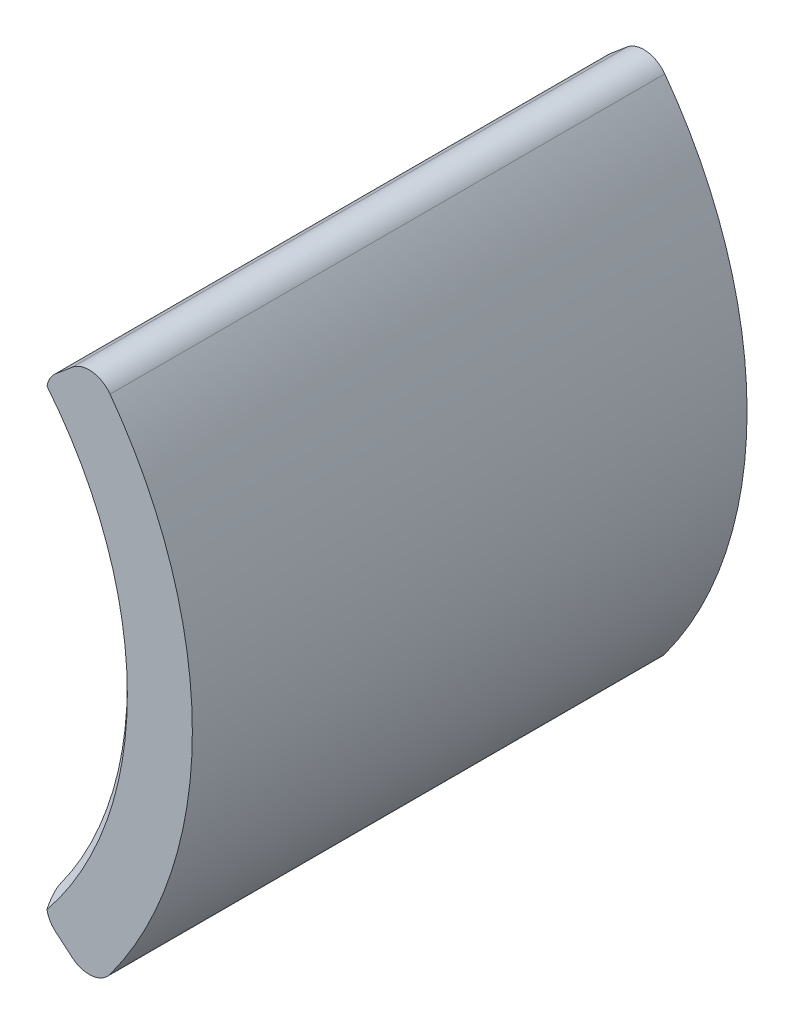
ISO-10303-21;
HEADER;
FILE_DESCRIPTION(('STEP AP214'),'2;1');
FILE_NAME('part.step','',(''),(''),'','','');
FILE_SCHEMA(('AUTOMOTIVE_DESIGN { 1 0 10303 214 1 1 1 1 }'));
ENDSEC;
DATA;
#1=APPLICATION_CONTEXT('core data for automotive mechanical design processes');
#2=APPLICATION_PROTOCOL_DEFINITION('international standard','automotive_design',2000,#1);
#3=PRODUCT_CONTEXT('',#1,'mechanical');
#4=PRODUCT('Part','Part','',(#3));
#5=PRODUCT_RELATED_PRODUCT_CATEGORY('part','',(#4));
#6=PRODUCT_DEFINITION_FORMATION('','',#4);
#7=PRODUCT_DEFINITION_CONTEXT('part definition',#1,'design');
#8=PRODUCT_DEFINITION('design','',#6,#7);
#9=PRODUCT_DEFINITION_SHAPE('','',#8);
#10=(LENGTH_UNIT() NAMED_UNIT(*) SI_UNIT(.MILLI.,.METRE.));
#11=(NAMED_UNIT(*) PLANE_ANGLE_UNIT() SI_UNIT($,.RADIAN.));
#12=(NAMED_UNIT(*) SI_UNIT($,.STERADIAN.) SOLID_ANGLE_UNIT());
#13=UNCERTAINTY_MEASURE_WITH_UNIT(LENGTH_MEASURE(1.E-05),#10,'distance_accuracy_value','');
#14=(GEOMETRIC_REPRESENTATION_CONTEXT(3) GLOBAL_UNCERTAINTY_ASSIGNED_CONTEXT((#13)) GLOBAL_UNIT_ASSIGNED_CONTEXT((#10,
#11,#12)) REPRESENTATION_CONTEXT('',''));
#15=CARTESIAN_POINT('',(0.,0.,0.));
#16=DIRECTION('',(0.,0.,1.));
#17=DIRECTION('',(1.,0.,0.));
#18=AXIS2_PLACEMENT_3D('',#15,#16,#17);
#19=CARTESIAN_POINT('',(0.,0.,64.));
#20=DIRECTION('',(0.,0.,-1.));
#21=DIRECTION('',(-1.,0.,0.));
#22=AXIS2_PLACEMENT_3D('',#19,#20,#21);
#23=CYLINDRICAL_SURFACE('',#22,49.);
#24=CARTESIAN_POINT('',(0.,0.,64.));
#25=DIRECTION('',(0.,0.,1.));
#26=DIRECTION('',(1.,0.,0.));
#27=AXIS2_PLACEMENT_3D('',#24,#25,#26);
#28=CIRCLE('',#27,49.);
#29=CARTESIAN_POINT('',(39.5103918075658,-28.9815275514013,64.));
#30=VERTEX_POINT('',#29);
#31=CARTESIAN_POINT('',(39.5103918075658,28.9815275514013,64.));
#32=VERTEX_POINT('',#31);
#33=EDGE_CURVE('E135',#30,#32,#28,.T.);
#34=ORIENTED_EDGE('',*,*,#33,.F.);
#35=DIRECTION('',(0.,0.,-1.));
#36=VECTOR('',#35,1.);
#37=CARTESIAN_POINT('',(39.5103918075658,-28.9815275514013,64.));
#38=LINE('',#37,#36);
#39=CARTESIAN_POINT('',(39.5103918075658,-28.9815275514013,0.));
#40=VERTEX_POINT('',#39);
#41=EDGE_CURVE('E120',#30,#40,#38,.T.);
#42=ORIENTED_EDGE('',*,*,#41,.T.);
#43=CARTESIAN_POINT('',(0.,0.,0.));
#44=DIRECTION('',(0.,0.,1.));
#45=DIRECTION('',(1.,0.,0.));
#46=AXIS2_PLACEMENT_3D('',#43,#44,#45);
#47=CIRCLE('',#46,49.);
#48=CARTESIAN_POINT('',(39.5103918075658,28.9815275514013,0.));
#49=VERTEX_POINT('',#48);
#50=EDGE_CURVE('E132',#40,#49,#47,.T.);
#51=ORIENTED_EDGE('',*,*,#50,.T.);
#52=DIRECTION('',(0.,0.,-1.));
#53=VECTOR('',#52,1.);
#54=CARTESIAN_POINT('',(39.5103918075658,28.9815275514013,64.));
#55=LINE('',#54,#53);
#56=EDGE_CURVE('E137',#49,#32,#55,.F.);
#57=ORIENTED_EDGE('',*,*,#56,.T.);
#58=EDGE_LOOP('',(#34,#42,#51,#57));
#59=FACE_BOUND('',#58,.T.);
#60=ADVANCED_FACE('F38',(#59),#23,.T.);
#61=CARTESIAN_POINT('',(31.0247999463187,26.0328981923047,64.));
#62=DIRECTION('',(0.642787609686535,-0.766044443118982,0.));
#63=DIRECTION('',(0.766044443118981,0.642787609686535,0.));
#64=AXIS2_PLACEMENT_3D('',#61,#62,#63);
#65=PLANE('',#64);
#66=DIRECTION('',(-0.766044443118981,-0.642787609686535,0.));
#67=VECTOR('',#66,1.);
#68=CARTESIAN_POINT('',(31.0247999463187,26.0328981923047,64.));
#69=LINE('',#68,#67);
#70=CARTESIAN_POINT('',(35.1630253984512,29.5052816429174,64.));
#71=VERTEX_POINT('',#70);
#72=CARTESIAN_POINT('',(33.2435928457746,27.8946864958968,64.));
#73=VERTEX_POINT('',#72);
#74=EDGE_CURVE('E153',#71,#73,#69,.T.);
#75=ORIENTED_EDGE('',*,*,#74,.F.);
#76=DIRECTION('',(0.,0.,-1.));
#77=VECTOR('',#76,1.);
#78=CARTESIAN_POINT('',(35.1630253984512,29.5052816429174,64.));
#79=LINE('',#78,#77);
#80=CARTESIAN_POINT('',(35.1630253984512,29.5052816429174,0.));
#81=VERTEX_POINT('',#80);
#82=EDGE_CURVE('E11',#71,#81,#79,.T.);
#83=ORIENTED_EDGE('',*,*,#82,.T.);
#84=DIRECTION('',(-0.766044443118981,-0.642787609686535,0.));
#85=VECTOR('',#84,1.);
#86=CARTESIAN_POINT('',(31.0247999463187,26.0328981923047,0.));
#87=LINE('',#86,#85);
#88=CARTESIAN_POINT('',(33.2435928457746,27.8946864958968,0.));
#89=VERTEX_POINT('',#88);
#90=EDGE_CURVE('E142',#81,#89,#87,.T.);
#91=ORIENTED_EDGE('',*,*,#90,.T.);
#92=DIRECTION('',(0.,0.,-1.));
#93=VECTOR('',#92,1.);
#94=CARTESIAN_POINT('',(33.2435928457746,27.8946864958968,64.));
#95=LINE('',#94,#93);
#96=EDGE_CURVE('E45',#89,#73,#95,.F.);
#97=ORIENTED_EDGE('',*,*,#96,.T.);
#98=EDGE_LOOP('',(#75,#83,#91,#97));
#99=FACE_BOUND('',#98,.T.);
#100=ADVANCED_FACE('F236',(#99),#65,.F.);
#101=CARTESIAN_POINT('',(0.,0.,64.));
#102=DIRECTION('',(0.,0.,-1.));
#103=DIRECTION('',(-1.,0.,0.));
#104=AXIS2_PLACEMENT_3D('',#101,#102,#103);
#105=CYLINDRICAL_SURFACE('',#104,40.5);
#106=CARTESIAN_POINT('',(0.,0.,0.999999999999987));
#107=DIRECTION('',(0.,0.,1.));
#108=DIRECTION('',(1.,0.,0.));
#109=AXIS2_PLACEMENT_3D('',#106,#107,#108);
#110=CIRCLE('',#109,40.5);
#111=CARTESIAN_POINT('',(32.7463035593284,23.831273637813,0.999999999999987));
#112=VERTEX_POINT('',#111);
#113=CARTESIAN_POINT('',(32.7463035593284,-23.831273637813,0.999999999999987));
#114=VERTEX_POINT('',#113);
#115=EDGE_CURVE('E158',#112,#114,#110,.F.);
#116=ORIENTED_EDGE('',*,*,#115,.T.);
#117=DIRECTION('',(0.,0.,-1.));
#118=VECTOR('',#117,1.);
#119=CARTESIAN_POINT('',(32.7463035593284,-23.831273637813,64.));
#120=LINE('',#119,#118);
#121=CARTESIAN_POINT('',(32.7463035593284,-23.831273637813,63.));
#122=VERTEX_POINT('',#121);
#123=EDGE_CURVE('E59',#114,#122,#120,.F.);
#124=ORIENTED_EDGE('',*,*,#123,.T.);
#125=CARTESIAN_POINT('',(0.,0.,63.));
#126=DIRECTION('',(0.,0.,1.));
#127=DIRECTION('',(1.,0.,0.));
#128=AXIS2_PLACEMENT_3D('',#125,#126,#127);
#129=CIRCLE('',#128,40.5);
#130=CARTESIAN_POINT('',(32.7463035593284,23.831273637813,63.));
#131=VERTEX_POINT('',#130);
#132=EDGE_CURVE('E156',#122,#131,#129,.T.);
#133=ORIENTED_EDGE('',*,*,#132,.T.);
#134=DIRECTION('',(0.,0.,-1.));
#135=VECTOR('',#134,1.);
#136=CARTESIAN_POINT('',(32.7463035593284,23.831273637813,64.));
#137=LINE('',#136,#135);
#138=EDGE_CURVE('E266',#131,#112,#137,.T.);
#139=ORIENTED_EDGE('',*,*,#138,.T.);
#140=EDGE_LOOP('',(#116,#124,#133,#139));
#141=FACE_BOUND('',#140,.T.);
#142=ADVANCED_FACE('F240',(#141),#105,.F.);
#143=CARTESIAN_POINT('',(0.,0.,64.));
#144=DIRECTION('',(0.,0.,1.));
#145=DIRECTION('',(1.,0.,0.));
#146=AXIS2_PLACEMENT_3D('',#143,#144,#145);
#147=PLANE('',#146);
#148=DIRECTION('',(-0.766044443118981,0.642787609686535,0.));
#149=VECTOR('',#148,1.);
#150=CARTESIAN_POINT('',(31.0247999463187,-26.0328981923047,64.));
#151=LINE('',#150,#149);
#152=CARTESIAN_POINT('',(35.1630253984512,-29.5052816429174,64.));
#153=VERTEX_POINT('',#152);
#154=CARTESIAN_POINT('',(33.2435928457746,-27.8946864958968,64.));
#155=VERTEX_POINT('',#154);
#156=EDGE_CURVE('E143',#153,#155,#151,.T.);
#157=ORIENTED_EDGE('',*,*,#156,.F.);
#158=CARTESIAN_POINT('',(37.0913882275108,-27.2071483135604,64.));
#159=DIRECTION('',(0.,0.,1.));
#160=DIRECTION('',(1.,0.,0.));
#161=AXIS2_PLACEMENT_3D('',#158,#159,#160);
#162=CIRCLE('',#161,3.);
#163=EDGE_CURVE('E179',#153,#30,#162,.T.);
#164=ORIENTED_EDGE('',*,*,#163,.T.);
#165=ORIENTED_EDGE('',*,*,#33,.T.);
#166=CARTESIAN_POINT('',(37.0913882275108,27.2071483135604,64.));
#167=DIRECTION('',(0.,0.,1.));
#168=DIRECTION('',(1.,0.,0.));
#169=AXIS2_PLACEMENT_3D('',#166,#167,#168);
#170=CIRCLE('',#169,3.);
#171=EDGE_CURVE('E175',#32,#71,#170,.T.);
#172=ORIENTED_EDGE('',*,*,#171,.T.);
#173=ORIENTED_EDGE('',*,*,#74,.T.);
#174=CARTESIAN_POINT('',(35.1719556748342,25.5965531665399,64.));
#175=DIRECTION('',(0.,0.,1.));
#176=DIRECTION('',(1.,0.,0.));
#177=AXIS2_PLACEMENT_3D('',#174,#175,#176);
#178=CIRCLE('',#177,3.);
#179=CARTESIAN_POINT('',(32.2236724686547,26.1511937133445,64.));
#180=VERTEX_POINT('',#179);
#181=EDGE_CURVE('E173',#73,#180,#178,.T.);
#182=ORIENTED_EDGE('',*,*,#181,.T.);
#183=CARTESIAN_POINT('',(0.,0.,64.));
#184=DIRECTION('',(0.,0.,1.));
#185=DIRECTION('',(1.,0.,0.));
#186=AXIS2_PLACEMENT_3D('',#183,#184,#185);
#187=CIRCLE('',#186,41.5);
#188=CARTESIAN_POINT('',(32.2236724686546,-26.1511937133445,64.));
#189=VERTEX_POINT('',#188);
#190=EDGE_CURVE('E163',#180,#189,#187,.F.);
#191=ORIENTED_EDGE('',*,*,#190,.T.);
#192=CARTESIAN_POINT('',(35.1719556748342,-25.5965531665399,64.));
#193=DIRECTION('',(0.,0.,1.));
#194=DIRECTION('',(1.,0.,0.));
#195=AXIS2_PLACEMENT_3D('',#192,#193,#194);
#196=CIRCLE('',#195,3.);
#197=EDGE_CURVE('E177',#189,#155,#196,.T.);
#198=ORIENTED_EDGE('',*,*,#197,.T.);
#199=EDGE_LOOP('',(#157,#164,#165,#172,#173,#182,#191,#198));
#200=FACE_BOUND('',#199,.T.);
#201=ADVANCED_FACE('F245',(#200),#147,.T.);
#202=CARTESIAN_POINT('',(0.,0.,0.));
#203=DIRECTION('',(0.,0.,1.));
#204=DIRECTION('',(1.,0.,0.));
#205=AXIS2_PLACEMENT_3D('',#202,#203,#204);
#206=PLANE('',#205);
#207=ORIENTED_EDGE('',*,*,#50,.F.);
#208=CARTESIAN_POINT('',(37.0913882275108,-27.2071483135604,0.));
#209=DIRECTION('',(0.,0.,1.));
#210=DIRECTION('',(1.,0.,0.));
#211=AXIS2_PLACEMENT_3D('',#208,#209,#210);
#212=CIRCLE('',#211,3.);
#213=CARTESIAN_POINT('',(35.1630253984512,-29.5052816429174,0.));
#214=VERTEX_POINT('',#213);
#215=EDGE_CURVE('E116',#40,#214,#212,.F.);
#216=ORIENTED_EDGE('',*,*,#215,.T.);
#217=DIRECTION('',(-0.766044443118981,0.642787609686535,0.));
#218=VECTOR('',#217,1.);
#219=CARTESIAN_POINT('',(31.0247999463187,-26.0328981923047,0.));
#220=LINE('',#219,#218);
#221=CARTESIAN_POINT('',(33.2435928457746,-27.8946864958968,0.));
#222=VERTEX_POINT('',#221);
#223=EDGE_CURVE('E148',#214,#222,#220,.T.);
#224=ORIENTED_EDGE('',*,*,#223,.T.);
#225=CARTESIAN_POINT('',(35.1719556748342,-25.5965531665399,0.));
#226=DIRECTION('',(0.,0.,1.));
#227=DIRECTION('',(1.,0.,0.));
#228=AXIS2_PLACEMENT_3D('',#225,#226,#227);
#229=CIRCLE('',#228,3.);
#230=CARTESIAN_POINT('',(32.2236724686546,-26.1511937133445,0.));
#231=VERTEX_POINT('',#230);
#232=EDGE_CURVE('E127',#222,#231,#229,.F.);
#233=ORIENTED_EDGE('',*,*,#232,.T.);
#234=CARTESIAN_POINT('',(0.,0.,0.));
#235=DIRECTION('',(0.,0.,1.));
#236=DIRECTION('',(1.,0.,0.));
#237=AXIS2_PLACEMENT_3D('',#234,#235,#236);
#238=CIRCLE('',#237,41.5);
#239=CARTESIAN_POINT('',(32.2236724686546,26.1511937133445,0.));
#240=VERTEX_POINT('',#239);
#241=EDGE_CURVE('E160',#231,#240,#238,.T.);
#242=ORIENTED_EDGE('',*,*,#241,.T.);
#243=CARTESIAN_POINT('',(35.1719556748342,25.5965531665399,0.));
#244=DIRECTION('',(0.,0.,1.));
#245=DIRECTION('',(1.,0.,0.));
#246=AXIS2_PLACEMENT_3D('',#243,#244,#245);
#247=CIRCLE('',#246,3.);
#248=EDGE_CURVE('E136',#240,#89,#247,.F.);
#249=ORIENTED_EDGE('',*,*,#248,.T.);
#250=ORIENTED_EDGE('',*,*,#90,.F.);
#251=CARTESIAN_POINT('',(37.0913882275108,27.2071483135604,0.));
#252=DIRECTION('',(0.,0.,1.));
#253=DIRECTION('',(1.,0.,0.));
#254=AXIS2_PLACEMENT_3D('',#251,#252,#253);
#255=CIRCLE('',#254,3.);
#256=EDGE_CURVE('E141',#81,#49,#255,.F.);
#257=ORIENTED_EDGE('',*,*,#256,.T.);
#258=EDGE_LOOP('',(#207,#216,#224,#233,#242,#249,#250,#257));
#259=FACE_BOUND('',#258,.T.);
#260=ADVANCED_FACE('F139',(#259),#206,.F.);
#261=CARTESIAN_POINT('',(31.0247999463187,-26.0328981923047,64.));
#262=DIRECTION('',(-0.642787609686535,-0.766044443118982,0.));
#263=DIRECTION('',(0.766044443118981,-0.642787609686535,0.));
#264=AXIS2_PLACEMENT_3D('',#261,#262,#263);
#265=PLANE('',#264);
#266=ORIENTED_EDGE('',*,*,#223,.F.);
#267=DIRECTION('',(0.,0.,1.));
#268=VECTOR('',#267,1.);
#269=CARTESIAN_POINT('',(35.1630253984512,-29.5052816429174,64.));
#270=LINE('',#269,#268);
#271=EDGE_CURVE('E121',#214,#153,#270,.T.);
#272=ORIENTED_EDGE('',*,*,#271,.T.);
#273=ORIENTED_EDGE('',*,*,#156,.T.);
#274=DIRECTION('',(0.,0.,1.));
#275=VECTOR('',#274,1.);
#276=CARTESIAN_POINT('',(33.2435928457746,-27.8946864958968,1.));
#277=LINE('',#276,#275);
#278=EDGE_CURVE('E126',#155,#222,#277,.F.);
#279=ORIENTED_EDGE('',*,*,#278,.T.);
#280=EDGE_LOOP('',(#266,#272,#273,#279));
#281=FACE_BOUND('',#280,.T.);
#282=ADVANCED_FACE('F253',(#281),#265,.T.);
#283=CARTESIAN_POINT('',(0.,0.,0.999999999999987));
#284=DIRECTION('',(0.,0.,-1.));
#285=DIRECTION('',(-1.,0.,0.));
#286=AXIS2_PLACEMENT_3D('',#283,#284,#285);
#287=CONICAL_SURFACE('',#286,40.5,0.785398163397445);
#288=ORIENTED_EDGE('',*,*,#241,.F.);
#289=CARTESIAN_POINT('',(32.2236724686546,-26.1511937133445,0.));
#290=CARTESIAN_POINT('',(32.2103514254475,-26.0803026082613,0.0550138442151829));
#291=CARTESIAN_POINT('',(32.1994088641915,-26.0081324635863,0.108911383420878));
#292=CARTESIAN_POINT('',(32.1827254099956,-25.8611500492179,0.214116720104511));
#293=CARTESIAN_POINT('',(32.1769941216582,-25.7863331639471,0.265419571851351));
#294=CARTESIAN_POINT('',(32.1682774994975,-25.5563131783319,0.415823140166275));
#295=CARTESIAN_POINT('',(32.1741225945499,-25.3972904594634,0.510038807464715));
#296=CARTESIAN_POINT('',(32.2087179610758,-25.1122841044407,0.658634082662441));
#297=CARTESIAN_POINT('',(32.2315267695966,-24.9877144830078,0.717123363866682));
#298=CARTESIAN_POINT('',(32.2946110482669,-24.7379064514921,0.819634392793185));
#299=CARTESIAN_POINT('',(32.3347502017811,-24.6126806452896,0.863764431271407));
#300=CARTESIAN_POINT('',(32.4064903526235,-24.4321064740838,0.915458969976691));
#301=CARTESIAN_POINT('',(32.4308866118528,-24.3757486199771,0.929864924914449));
#302=CARTESIAN_POINT('',(32.4834677392055,-24.2639461125433,0.954826381325389));
#303=CARTESIAN_POINT('',(32.511651832098,-24.2085012749547,0.96538266904707));
#304=CARTESIAN_POINT('',(32.5721193235421,-24.0982707567603,0.982526108462248));
#305=CARTESIAN_POINT('',(32.6044524451278,-24.0435037704255,0.98905836498089));
#306=CARTESIAN_POINT('',(32.6727281808418,-23.9358446659341,0.997805744717024));
#307=CARTESIAN_POINT('',(32.7086738965911,-23.8829542125133,1.00001712433858));
#308=CARTESIAN_POINT('',(32.7463035593284,-23.831273637813,0.999999999999975));
#309=B_SPLINE_CURVE_WITH_KNOTS('',3,(#289,#290,#291,#292,#293,#294,#295,#296,#297,#298,#299,
#300,#301,#302,#303,#304,#305,#306,#307,#308),.UNSPECIFIED.,.F.,.F.,(4,2,2,2,2,2,2,2,2,4),(0.,
0.272028513424062,0.544557376937042,1.09632284620955,1.51335887065593,1.92717269397602,
2.11621517473923,2.30521902418418,2.49674722391751,2.68844128970857),.UNSPECIFIED.);
#310=EDGE_CURVE('E189',#231,#114,#309,.T.);
#311=ORIENTED_EDGE('',*,*,#310,.T.);
#312=ORIENTED_EDGE('',*,*,#115,.F.);
#313=CARTESIAN_POINT('',(32.7463035593284,23.831273637813,0.999999999999987));
#314=CARTESIAN_POINT('',(32.7072914056439,23.8848497623657,1.00001983548113));
#315=CARTESIAN_POINT('',(32.6700917203676,23.9397267242447,0.997641849183981));
#316=CARTESIAN_POINT('',(32.5995878252425,24.0514783526174,0.988243129872139));
#317=CARTESIAN_POINT('',(32.5662800705546,24.1083511388942,0.981226661075221));
#318=CARTESIAN_POINT('',(32.5041909120756,24.2227930465525,0.962831596788666));
#319=CARTESIAN_POINT('',(32.475353222263,24.2803416235168,0.951514744006793));
#320=CARTESIAN_POINT('',(32.4217495772256,24.396363187576,0.924780070450901));
#321=CARTESIAN_POINT('',(32.3969842782828,24.4548363220059,0.909361589729242));
#322=CARTESIAN_POINT('',(32.3289996045598,24.6304869754151,0.857526999339638));
#323=CARTESIAN_POINT('',(32.2918191188167,24.7484051985553,0.815446106236097));
#324=CARTESIAN_POINT('',(32.2326988070683,24.983652937744,0.718665213276993));
#325=CARTESIAN_POINT('',(32.2108706589755,25.1009720996513,0.663876523828348));
#326=CARTESIAN_POINT('',(32.1749770252846,25.3822155722216,0.518718661815319));
#327=CARTESIAN_POINT('',(32.1683054916941,25.5444468591182,0.423189024583629));
#328=CARTESIAN_POINT('',(32.1765015063444,25.7790659728005,0.270350129121975));
#329=CARTESIAN_POINT('',(32.1821854769028,25.855412910174,0.218132563967498));
#330=CARTESIAN_POINT('',(32.1989878706493,26.0053427866841,0.110993103488768));
#331=CARTESIAN_POINT('',(32.2100952813021,26.0789310028568,0.0560768902560157));
#332=CARTESIAN_POINT('',(32.2236724686546,26.1511937133445,0.));
#333=B_SPLINE_CURVE_WITH_KNOTS('',3,(#313,#314,#315,#316,#317,#318,#319,#320,#321,#322,#323,
#324,#325,#326,#327,#328,#329,#330,#331,#332),.UNSPECIFIED.,.F.,.F.,(4,2,2,2,2,2,2,2,2,4),(0.,
0.198721023892071,0.397259614515982,0.593049258886029,0.788870424678578,1.17878455459723,
1.57150650436054,2.13339445574118,2.41123473683686,2.6885131824561),.UNSPECIFIED.);
#334=EDGE_CURVE('E181',#112,#240,#333,.T.);
#335=ORIENTED_EDGE('',*,*,#334,.T.);
#336=EDGE_LOOP('',(#288,#311,#312,#335));
#337=FACE_BOUND('',#336,.T.);
#338=ADVANCED_FACE('F196',(#337),#287,.F.);
#339=CARTESIAN_POINT('',(0.,0.,64.));
#340=DIRECTION('',(0.,0.,1.));
#341=DIRECTION('',(1.,0.,0.));
#342=AXIS2_PLACEMENT_3D('',#339,#340,#341);
#343=CONICAL_SURFACE('',#342,41.5,0.785398163397448);
#344=ORIENTED_EDGE('',*,*,#132,.F.);
#345=CARTESIAN_POINT('',(32.7463035593284,-23.831273637813,63.));
#346=CARTESIAN_POINT('',(32.7072914056439,-23.8848497623657,62.9999801645189));
#347=CARTESIAN_POINT('',(32.6700917203676,-23.9397267242447,63.002358150816));
#348=CARTESIAN_POINT('',(32.5995878252425,-24.0514783526174,63.0117568701278));
#349=CARTESIAN_POINT('',(32.5662800705546,-24.1083511388942,63.0187733389248));
#350=CARTESIAN_POINT('',(32.5041909120756,-24.2227930465525,63.0371684032113));
#351=CARTESIAN_POINT('',(32.475353222263,-24.2803416235168,63.0484852559932));
#352=CARTESIAN_POINT('',(32.4217495772256,-24.396363187576,63.0752199295491));
#353=CARTESIAN_POINT('',(32.3969842782828,-24.454836322006,63.0906384102707));
#354=CARTESIAN_POINT('',(32.3289996045598,-24.6304869754151,63.1424730006604));
#355=CARTESIAN_POINT('',(32.2918191188167,-24.7484051985553,63.1845538937639));
#356=CARTESIAN_POINT('',(32.2326988070683,-24.983652937744,63.281334786723));
#357=CARTESIAN_POINT('',(32.2108706589755,-25.1009720996513,63.3361234761716));
#358=CARTESIAN_POINT('',(32.1749770252846,-25.3822155722216,63.4812813381847));
#359=CARTESIAN_POINT('',(32.1683054916941,-25.5444468591182,63.5768109754164));
#360=CARTESIAN_POINT('',(32.1765015063444,-25.7790659728005,63.729649870878));
#361=CARTESIAN_POINT('',(32.1821854769028,-25.855412910174,63.7818674360325));
#362=CARTESIAN_POINT('',(32.1989878706493,-26.0053427866841,63.8890068965112));
#363=CARTESIAN_POINT('',(32.2100952813021,-26.0789310028568,63.943923109744));
#364=CARTESIAN_POINT('',(32.2236724686546,-26.1511937133445,64.));
#365=B_SPLINE_CURVE_WITH_KNOTS('',3,(#345,#346,#347,#348,#349,#350,#351,#352,#353,#354,#355,
#356,#357,#358,#359,#360,#361,#362,#363,#364),.UNSPECIFIED.,.F.,.F.,(4,2,2,2,2,2,2,2,2,4),(0.,
0.198721023892071,0.397259614515988,0.593049258886035,0.78887042467858,1.17878455459723,
1.57150650436054,2.13339445574119,2.41123473683688,2.68851318245614),.UNSPECIFIED.);
#366=EDGE_CURVE('E214',#122,#189,#365,.T.);
#367=ORIENTED_EDGE('',*,*,#366,.T.);
#368=ORIENTED_EDGE('',*,*,#190,.F.);
#369=CARTESIAN_POINT('',(32.2236724686547,26.1511937133445,64.));
#370=CARTESIAN_POINT('',(32.2103514254475,26.0803026082613,63.9449861557848));
#371=CARTESIAN_POINT('',(32.1994088641915,26.0081324635863,63.8910886165791));
#372=CARTESIAN_POINT('',(32.1827254099956,25.861150049218,63.7858832798955));
#373=CARTESIAN_POINT('',(32.1769941216582,25.7863331639472,63.7345804281486));
#374=CARTESIAN_POINT('',(32.1682774994975,25.5563131783319,63.5841768598337));
#375=CARTESIAN_POINT('',(32.1741225945499,25.3972904594635,63.4899611925353));
#376=CARTESIAN_POINT('',(32.2087179610758,25.1122841044407,63.3413659173376));
#377=CARTESIAN_POINT('',(32.2315267695966,24.9877144830079,63.2828766361333));
#378=CARTESIAN_POINT('',(32.2946110482669,24.7379064514922,63.1803656072068));
#379=CARTESIAN_POINT('',(32.3347502017811,24.6126806452896,63.1362355687286));
#380=CARTESIAN_POINT('',(32.4064903526235,24.4321064740838,63.0845410300233));
#381=CARTESIAN_POINT('',(32.4308866118528,24.3757486199771,63.0701350750855));
#382=CARTESIAN_POINT('',(32.4834677392055,24.2639461125433,63.0451736186746));
#383=CARTESIAN_POINT('',(32.511651832098,24.2085012749547,63.0346173309529));
#384=CARTESIAN_POINT('',(32.5721193235421,24.0982707567603,63.0174738915377));
#385=CARTESIAN_POINT('',(32.6044524451278,24.0435037704255,63.0109416350191));
#386=CARTESIAN_POINT('',(32.6727281808418,23.9358446659341,63.002194255283));
#387=CARTESIAN_POINT('',(32.7086738965911,23.8829542125133,62.9999828756614));
#388=CARTESIAN_POINT('',(32.7463035593284,23.831273637813,63.));
#389=B_SPLINE_CURVE_WITH_KNOTS('',3,(#369,#370,#371,#372,#373,#374,#375,#376,#377,#378,#379,
#380,#381,#382,#383,#384,#385,#386,#387,#388),.UNSPECIFIED.,.F.,.F.,(4,2,2,2,2,2,2,2,2,4),(0.,
0.272028513424059,0.544557376937046,1.09632284620955,1.51335887065594,1.92717269397603,
2.11621517473924,2.3052190241842,2.49674722391753,2.6884412897086),.UNSPECIFIED.);
#390=EDGE_CURVE('E52',#180,#131,#389,.T.);
#391=ORIENTED_EDGE('',*,*,#390,.T.);
#392=EDGE_LOOP('',(#344,#367,#368,#391));
#393=FACE_BOUND('',#392,.T.);
#394=ADVANCED_FACE('F219',(#393),#343,.F.);
#395=CARTESIAN_POINT('',(37.0913882275108,-27.2071483135604,64.));
#396=DIRECTION('',(0.,0.,-1.));
#397=DIRECTION('',(-1.,0.,0.));
#398=AXIS2_PLACEMENT_3D('',#395,#396,#397);
#399=CYLINDRICAL_SURFACE('',#398,3.);
#400=ORIENTED_EDGE('',*,*,#163,.F.);
#401=ORIENTED_EDGE('',*,*,#271,.F.);
#402=ORIENTED_EDGE('',*,*,#215,.F.);
#403=ORIENTED_EDGE('',*,*,#41,.F.);
#404=EDGE_LOOP('',(#400,#401,#402,#403));
#405=FACE_BOUND('',#404,.T.);
#406=ADVANCED_FACE('F119',(#405),#399,.T.);
#407=CARTESIAN_POINT('',(35.1719556748342,-25.5965531665399,64.));
#408=DIRECTION('',(0.,0.,-1.));
#409=DIRECTION('',(-1.,0.,0.));
#410=AXIS2_PLACEMENT_3D('',#407,#408,#409);
#411=CYLINDRICAL_SURFACE('',#410,3.);
#412=ORIENTED_EDGE('',*,*,#366,.F.);
#413=ORIENTED_EDGE('',*,*,#123,.F.);
#414=ORIENTED_EDGE('',*,*,#310,.F.);
#415=ORIENTED_EDGE('',*,*,#232,.F.);
#416=ORIENTED_EDGE('',*,*,#278,.F.);
#417=ORIENTED_EDGE('',*,*,#197,.F.);
#418=EDGE_LOOP('',(#412,#413,#414,#415,#416,#417));
#419=FACE_BOUND('',#418,.T.);
#420=ADVANCED_FACE('F225',(#419),#411,.T.);
#421=CARTESIAN_POINT('',(37.0913882275108,27.2071483135604,64.));
#422=DIRECTION('',(0.,0.,-1.));
#423=DIRECTION('',(-1.,0.,0.));
#424=AXIS2_PLACEMENT_3D('',#421,#422,#423);
#425=CYLINDRICAL_SURFACE('',#424,3.);
#426=ORIENTED_EDGE('',*,*,#171,.F.);
#427=ORIENTED_EDGE('',*,*,#56,.F.);
#428=ORIENTED_EDGE('',*,*,#256,.F.);
#429=ORIENTED_EDGE('',*,*,#82,.F.);
#430=EDGE_LOOP('',(#426,#427,#428,#429));
#431=FACE_BOUND('',#430,.T.);
#432=ADVANCED_FACE('F204',(#431),#425,.T.);
#433=CARTESIAN_POINT('',(35.1719556748342,25.5965531665399,64.));
#434=DIRECTION('',(0.,0.,-1.));
#435=DIRECTION('',(-1.,0.,0.));
#436=AXIS2_PLACEMENT_3D('',#433,#434,#435);
#437=CYLINDRICAL_SURFACE('',#436,3.);
#438=ORIENTED_EDGE('',*,*,#181,.F.);
#439=ORIENTED_EDGE('',*,*,#96,.F.);
#440=ORIENTED_EDGE('',*,*,#248,.F.);
#441=ORIENTED_EDGE('',*,*,#334,.F.);
#442=ORIENTED_EDGE('',*,*,#138,.F.);
#443=ORIENTED_EDGE('',*,*,#390,.F.);
#444=EDGE_LOOP('',(#438,#439,#440,#441,#442,#443));
#445=FACE_BOUND('',#444,.T.);
#446=ADVANCED_FACE('F200',(#445),#437,.T.);
#447=CLOSED_SHELL('',(#60,#100,#142,#201,#260,#282,#338,#394,#406,#420,#432,#446));
#448=MANIFOLD_SOLID_BREP('B2',#447);
#449=ADVANCED_BREP_SHAPE_REPRESENTATION('',(#18,#448),#14);
#450=SHAPE_DEFINITION_REPRESENTATION(#9,#449);
ENDSEC;
END-ISO-10303-21;
